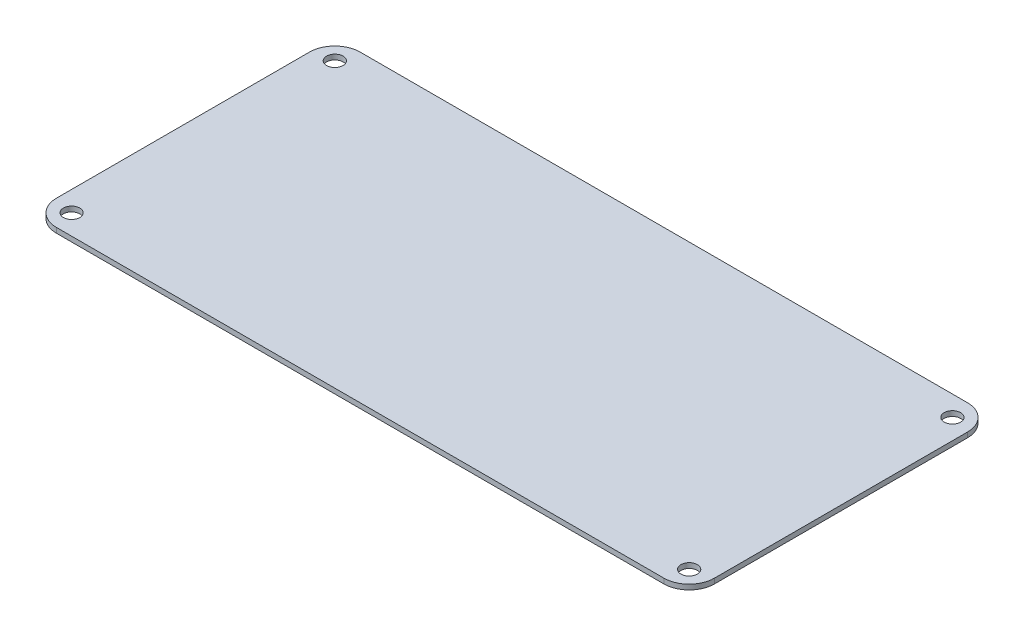
ISO-10303-21;
HEADER;
FILE_DESCRIPTION(('STEP AP214'),'2;1');
FILE_NAME('part.step','',(''),(''),'','','');
FILE_SCHEMA(('AUTOMOTIVE_DESIGN { 1 0 10303 214 1 1 1 1 }'));
ENDSEC;
DATA;
#1=APPLICATION_CONTEXT('core data for automotive mechanical design processes');
#2=APPLICATION_PROTOCOL_DEFINITION('international standard','automotive_design',2000,#1);
#3=PRODUCT_CONTEXT('',#1,'mechanical');
#4=PRODUCT('Part','Part','',(#3));
#5=PRODUCT_RELATED_PRODUCT_CATEGORY('part','',(#4));
#6=PRODUCT_DEFINITION_FORMATION('','',#4);
#7=PRODUCT_DEFINITION_CONTEXT('part definition',#1,'design');
#8=PRODUCT_DEFINITION('design','',#6,#7);
#9=PRODUCT_DEFINITION_SHAPE('','',#8);
#10=(LENGTH_UNIT() NAMED_UNIT(*) SI_UNIT(.MILLI.,.METRE.));
#11=(NAMED_UNIT(*) PLANE_ANGLE_UNIT() SI_UNIT($,.RADIAN.));
#12=(NAMED_UNIT(*) SI_UNIT($,.STERADIAN.) SOLID_ANGLE_UNIT());
#13=UNCERTAINTY_MEASURE_WITH_UNIT(LENGTH_MEASURE(1.E-05),#10,'distance_accuracy_value','');
#14=(GEOMETRIC_REPRESENTATION_CONTEXT(3) GLOBAL_UNCERTAINTY_ASSIGNED_CONTEXT((#13)) GLOBAL_UNIT_ASSIGNED_CONTEXT((#10,
#11,#12)) REPRESENTATION_CONTEXT('',''));
#15=CARTESIAN_POINT('',(0.,0.,0.));
#16=DIRECTION('',(0.,0.,1.));
#17=DIRECTION('',(1.,0.,0.));
#18=AXIS2_PLACEMENT_3D('',#15,#16,#17);
#19=CARTESIAN_POINT('',(-120.,2.,-50.));
#20=DIRECTION('',(0.,-1.,0.));
#21=DIRECTION('',(0.,0.,-1.));
#22=AXIS2_PLACEMENT_3D('',#19,#20,#21);
#23=CYLINDRICAL_SURFACE('',#22,9.99999999999999);
#24=CARTESIAN_POINT('',(-120.,0.,-50.));
#25=DIRECTION('',(0.,1.,0.));
#26=DIRECTION('',(0.,0.,1.));
#27=AXIS2_PLACEMENT_3D('',#24,#25,#26);
#28=CIRCLE('',#27,9.99999999999999);
#29=CARTESIAN_POINT('',(-120.,0.,-60.));
#30=VERTEX_POINT('',#29);
#31=CARTESIAN_POINT('',(-130.,0.,-50.));
#32=VERTEX_POINT('',#31);
#33=EDGE_CURVE('E131',#30,#32,#28,.T.);
#34=ORIENTED_EDGE('',*,*,#33,.T.);
#35=DIRECTION('',(0.,-1.,0.));
#36=VECTOR('',#35,1.);
#37=CARTESIAN_POINT('',(-130.,2.,-50.));
#38=LINE('',#37,#36);
#39=CARTESIAN_POINT('',(-130.,2.,-50.));
#40=VERTEX_POINT('',#39);
#41=EDGE_CURVE('E11',#40,#32,#38,.T.);
#42=ORIENTED_EDGE('',*,*,#41,.F.);
#43=CARTESIAN_POINT('',(-120.,2.,-50.));
#44=DIRECTION('',(0.,1.,0.));
#45=DIRECTION('',(0.,0.,1.));
#46=AXIS2_PLACEMENT_3D('',#43,#44,#45);
#47=CIRCLE('',#46,9.99999999999999);
#48=CARTESIAN_POINT('',(-120.,2.,-60.));
#49=VERTEX_POINT('',#48);
#50=EDGE_CURVE('E145',#49,#40,#47,.T.);
#51=ORIENTED_EDGE('',*,*,#50,.F.);
#52=DIRECTION('',(0.,-1.,0.));
#53=VECTOR('',#52,1.);
#54=CARTESIAN_POINT('',(-120.,2.,-60.));
#55=LINE('',#54,#53);
#56=EDGE_CURVE('E127',#49,#30,#55,.T.);
#57=ORIENTED_EDGE('',*,*,#56,.T.);
#58=EDGE_LOOP('',(#34,#42,#51,#57));
#59=FACE_BOUND('',#58,.T.);
#60=ADVANCED_FACE('F33',(#59),#23,.T.);
#61=CARTESIAN_POINT('',(-130.,2.,-50.));
#62=DIRECTION('',(1.,0.,0.));
#63=DIRECTION('',(0.,0.,-1.));
#64=AXIS2_PLACEMENT_3D('',#61,#62,#63);
#65=PLANE('',#64);
#66=DIRECTION('',(0.,0.,1.));
#67=VECTOR('',#66,1.);
#68=CARTESIAN_POINT('',(-130.,0.,-50.));
#69=LINE('',#68,#67);
#70=CARTESIAN_POINT('',(-130.,0.,50.));
#71=VERTEX_POINT('',#70);
#72=EDGE_CURVE('E134',#32,#71,#69,.T.);
#73=ORIENTED_EDGE('',*,*,#72,.T.);
#74=DIRECTION('',(0.,-1.,0.));
#75=VECTOR('',#74,1.);
#76=CARTESIAN_POINT('',(-130.,2.,50.));
#77=LINE('',#76,#75);
#78=CARTESIAN_POINT('',(-130.,2.,50.));
#79=VERTEX_POINT('',#78);
#80=EDGE_CURVE('E42',#79,#71,#77,.T.);
#81=ORIENTED_EDGE('',*,*,#80,.F.);
#82=DIRECTION('',(0.,0.,1.));
#83=VECTOR('',#82,1.);
#84=CARTESIAN_POINT('',(-130.,2.,-50.));
#85=LINE('',#84,#83);
#86=EDGE_CURVE('E94',#40,#79,#85,.T.);
#87=ORIENTED_EDGE('',*,*,#86,.F.);
#88=ORIENTED_EDGE('',*,*,#41,.T.);
#89=EDGE_LOOP('',(#73,#81,#87,#88));
#90=FACE_BOUND('',#89,.T.);
#91=ADVANCED_FACE('F186',(#90),#65,.F.);
#92=CARTESIAN_POINT('',(-120.,2.,50.));
#93=DIRECTION('',(0.,-1.,0.));
#94=DIRECTION('',(0.,0.,-1.));
#95=AXIS2_PLACEMENT_3D('',#92,#93,#94);
#96=CYLINDRICAL_SURFACE('',#95,10.);
#97=CARTESIAN_POINT('',(-120.,0.,50.));
#98=DIRECTION('',(0.,1.,0.));
#99=DIRECTION('',(0.,0.,1.));
#100=AXIS2_PLACEMENT_3D('',#97,#98,#99);
#101=CIRCLE('',#100,10.);
#102=CARTESIAN_POINT('',(-120.,0.,60.));
#103=VERTEX_POINT('',#102);
#104=EDGE_CURVE('E136',#71,#103,#101,.T.);
#105=ORIENTED_EDGE('',*,*,#104,.T.);
#106=DIRECTION('',(0.,-1.,0.));
#107=VECTOR('',#106,1.);
#108=CARTESIAN_POINT('',(-120.,2.,60.));
#109=LINE('',#108,#107);
#110=CARTESIAN_POINT('',(-120.,2.,60.));
#111=VERTEX_POINT('',#110);
#112=EDGE_CURVE('E152',#111,#103,#109,.T.);
#113=ORIENTED_EDGE('',*,*,#112,.F.);
#114=CARTESIAN_POINT('',(-120.,2.,50.));
#115=DIRECTION('',(0.,1.,0.));
#116=DIRECTION('',(0.,0.,1.));
#117=AXIS2_PLACEMENT_3D('',#114,#115,#116);
#118=CIRCLE('',#117,10.);
#119=EDGE_CURVE('E201',#79,#111,#118,.T.);
#120=ORIENTED_EDGE('',*,*,#119,.F.);
#121=ORIENTED_EDGE('',*,*,#80,.T.);
#122=EDGE_LOOP('',(#105,#113,#120,#121));
#123=FACE_BOUND('',#122,.T.);
#124=ADVANCED_FACE('F191',(#123),#96,.T.);
#125=CARTESIAN_POINT('',(-120.,2.,60.));
#126=DIRECTION('',(0.,0.,-1.));
#127=DIRECTION('',(-1.,0.,0.));
#128=AXIS2_PLACEMENT_3D('',#125,#126,#127);
#129=PLANE('',#128);
#130=DIRECTION('',(1.,0.,0.));
#131=VECTOR('',#130,1.);
#132=CARTESIAN_POINT('',(-120.,0.,60.));
#133=LINE('',#132,#131);
#134=CARTESIAN_POINT('',(120.,0.,60.));
#135=VERTEX_POINT('',#134);
#136=EDGE_CURVE('E138',#103,#135,#133,.T.);
#137=ORIENTED_EDGE('',*,*,#136,.T.);
#138=DIRECTION('',(0.,-1.,0.));
#139=VECTOR('',#138,1.);
#140=CARTESIAN_POINT('',(120.,2.,60.));
#141=LINE('',#140,#139);
#142=CARTESIAN_POINT('',(120.,2.,60.));
#143=VERTEX_POINT('',#142);
#144=EDGE_CURVE('E149',#143,#135,#141,.T.);
#145=ORIENTED_EDGE('',*,*,#144,.F.);
#146=DIRECTION('',(1.,0.,0.));
#147=VECTOR('',#146,1.);
#148=CARTESIAN_POINT('',(-120.,2.,60.));
#149=LINE('',#148,#147);
#150=EDGE_CURVE('E203',#111,#143,#149,.T.);
#151=ORIENTED_EDGE('',*,*,#150,.F.);
#152=ORIENTED_EDGE('',*,*,#112,.T.);
#153=EDGE_LOOP('',(#137,#145,#151,#152));
#154=FACE_BOUND('',#153,.T.);
#155=ADVANCED_FACE('F248',(#154),#129,.F.);
#156=CARTESIAN_POINT('',(120.,2.,50.));
#157=DIRECTION('',(0.,-1.,0.));
#158=DIRECTION('',(0.,0.,-1.));
#159=AXIS2_PLACEMENT_3D('',#156,#157,#158);
#160=CYLINDRICAL_SURFACE('',#159,10.);
#161=CARTESIAN_POINT('',(120.,0.,50.));
#162=DIRECTION('',(0.,1.,0.));
#163=DIRECTION('',(0.,0.,1.));
#164=AXIS2_PLACEMENT_3D('',#161,#162,#163);
#165=CIRCLE('',#164,10.);
#166=CARTESIAN_POINT('',(130.,0.,50.));
#167=VERTEX_POINT('',#166);
#168=EDGE_CURVE('E140',#135,#167,#165,.T.);
#169=ORIENTED_EDGE('',*,*,#168,.T.);
#170=DIRECTION('',(0.,-1.,0.));
#171=VECTOR('',#170,1.);
#172=CARTESIAN_POINT('',(130.,2.,50.));
#173=LINE('',#172,#171);
#174=CARTESIAN_POINT('',(130.,2.,50.));
#175=VERTEX_POINT('',#174);
#176=EDGE_CURVE('E122',#175,#167,#173,.T.);
#177=ORIENTED_EDGE('',*,*,#176,.F.);
#178=CARTESIAN_POINT('',(120.,2.,50.));
#179=DIRECTION('',(0.,1.,0.));
#180=DIRECTION('',(0.,0.,1.));
#181=AXIS2_PLACEMENT_3D('',#178,#179,#180);
#182=CIRCLE('',#181,10.);
#183=EDGE_CURVE('E113',#143,#175,#182,.T.);
#184=ORIENTED_EDGE('',*,*,#183,.F.);
#185=ORIENTED_EDGE('',*,*,#144,.T.);
#186=EDGE_LOOP('',(#169,#177,#184,#185));
#187=FACE_BOUND('',#186,.T.);
#188=ADVANCED_FACE('F245',(#187),#160,.T.);
#189=CARTESIAN_POINT('',(130.,2.,50.));
#190=DIRECTION('',(-1.,0.,0.));
#191=DIRECTION('',(0.,0.,1.));
#192=AXIS2_PLACEMENT_3D('',#189,#190,#191);
#193=PLANE('',#192);
#194=DIRECTION('',(0.,0.,-1.));
#195=VECTOR('',#194,1.);
#196=CARTESIAN_POINT('',(130.,0.,50.));
#197=LINE('',#196,#195);
#198=CARTESIAN_POINT('',(130.,0.,-50.));
#199=VERTEX_POINT('',#198);
#200=EDGE_CURVE('E121',#167,#199,#197,.T.);
#201=ORIENTED_EDGE('',*,*,#200,.T.);
#202=DIRECTION('',(0.,-1.,0.));
#203=VECTOR('',#202,1.);
#204=CARTESIAN_POINT('',(130.,2.,-50.));
#205=LINE('',#204,#203);
#206=CARTESIAN_POINT('',(130.,2.,-50.));
#207=VERTEX_POINT('',#206);
#208=EDGE_CURVE('E118',#207,#199,#205,.T.);
#209=ORIENTED_EDGE('',*,*,#208,.F.);
#210=DIRECTION('',(0.,0.,-1.));
#211=VECTOR('',#210,1.);
#212=CARTESIAN_POINT('',(130.,2.,50.));
#213=LINE('',#212,#211);
#214=EDGE_CURVE('E107',#175,#207,#213,.T.);
#215=ORIENTED_EDGE('',*,*,#214,.F.);
#216=ORIENTED_EDGE('',*,*,#176,.T.);
#217=EDGE_LOOP('',(#201,#209,#215,#216));
#218=FACE_BOUND('',#217,.T.);
#219=ADVANCED_FACE('F119',(#218),#193,.F.);
#220=CARTESIAN_POINT('',(120.,2.,-50.));
#221=DIRECTION('',(0.,-1.,0.));
#222=DIRECTION('',(0.,0.,-1.));
#223=AXIS2_PLACEMENT_3D('',#220,#221,#222);
#224=CYLINDRICAL_SURFACE('',#223,10.);
#225=CARTESIAN_POINT('',(120.,0.,-50.));
#226=DIRECTION('',(0.,1.,0.));
#227=DIRECTION('',(0.,0.,1.));
#228=AXIS2_PLACEMENT_3D('',#225,#226,#227);
#229=CIRCLE('',#228,10.);
#230=CARTESIAN_POINT('',(120.,0.,-60.));
#231=VERTEX_POINT('',#230);
#232=EDGE_CURVE('E80',#199,#231,#229,.T.);
#233=ORIENTED_EDGE('',*,*,#232,.T.);
#234=DIRECTION('',(0.,-1.,0.));
#235=VECTOR('',#234,1.);
#236=CARTESIAN_POINT('',(120.,2.,-60.));
#237=LINE('',#236,#235);
#238=CARTESIAN_POINT('',(120.,2.,-60.));
#239=VERTEX_POINT('',#238);
#240=EDGE_CURVE('E123',#239,#231,#237,.T.);
#241=ORIENTED_EDGE('',*,*,#240,.F.);
#242=CARTESIAN_POINT('',(120.,2.,-50.));
#243=DIRECTION('',(0.,1.,0.));
#244=DIRECTION('',(0.,0.,1.));
#245=AXIS2_PLACEMENT_3D('',#242,#243,#244);
#246=CIRCLE('',#245,10.);
#247=EDGE_CURVE('E111',#207,#239,#246,.T.);
#248=ORIENTED_EDGE('',*,*,#247,.F.);
#249=ORIENTED_EDGE('',*,*,#208,.T.);
#250=EDGE_LOOP('',(#233,#241,#248,#249));
#251=FACE_BOUND('',#250,.T.);
#252=ADVANCED_FACE('F125',(#251),#224,.T.);
#253=CARTESIAN_POINT('',(120.,2.,-60.));
#254=DIRECTION('',(0.,0.,1.));
#255=DIRECTION('',(1.,0.,0.));
#256=AXIS2_PLACEMENT_3D('',#253,#254,#255);
#257=PLANE('',#256);
#258=DIRECTION('',(-1.,0.,0.));
#259=VECTOR('',#258,1.);
#260=CARTESIAN_POINT('',(120.,0.,-60.));
#261=LINE('',#260,#259);
#262=EDGE_CURVE('E86',#231,#30,#261,.T.);
#263=ORIENTED_EDGE('',*,*,#262,.T.);
#264=ORIENTED_EDGE('',*,*,#56,.F.);
#265=DIRECTION('',(-1.,0.,0.));
#266=VECTOR('',#265,1.);
#267=CARTESIAN_POINT('',(120.,2.,-60.));
#268=LINE('',#267,#266);
#269=EDGE_CURVE('E51',#239,#49,#268,.T.);
#270=ORIENTED_EDGE('',*,*,#269,.F.);
#271=ORIENTED_EDGE('',*,*,#240,.T.);
#272=EDGE_LOOP('',(#263,#264,#270,#271));
#273=FACE_BOUND('',#272,.T.);
#274=ADVANCED_FACE('F224',(#273),#257,.F.);
#275=CARTESIAN_POINT('',(-120.,2.,-50.));
#276=DIRECTION('',(0.,1.,0.));
#277=DIRECTION('',(0.,0.,1.));
#278=AXIS2_PLACEMENT_3D('',#275,#276,#277);
#279=PLANE('',#278);
#280=CARTESIAN_POINT('',(122.,2.,-52.));
#281=DIRECTION('',(0.,1.,0.));
#282=DIRECTION('',(0.,0.,1.));
#283=AXIS2_PLACEMENT_3D('',#280,#281,#282);
#284=CIRCLE('',#283,3.24999999999999);
#285=CARTESIAN_POINT('',(122.,2.,-48.75));
#286=VERTEX_POINT('',#285);
#287=EDGE_CURVE('E212',#286,#286,#284,.T.);
#288=ORIENTED_EDGE('',*,*,#287,.F.);
#289=EDGE_LOOP('',(#288));
#290=FACE_BOUND('',#289,.T.);
#291=CARTESIAN_POINT('',(122.,2.,52.));
#292=DIRECTION('',(0.,1.,0.));
#293=DIRECTION('',(0.,0.,1.));
#294=AXIS2_PLACEMENT_3D('',#291,#292,#293);
#295=CIRCLE('',#294,3.24999999999999);
#296=CARTESIAN_POINT('',(122.,2.,55.25));
#297=VERTEX_POINT('',#296);
#298=EDGE_CURVE('E214',#297,#297,#295,.T.);
#299=ORIENTED_EDGE('',*,*,#298,.F.);
#300=EDGE_LOOP('',(#299));
#301=FACE_BOUND('',#300,.T.);
#302=CARTESIAN_POINT('',(-122.,2.,52.));
#303=DIRECTION('',(0.,1.,0.));
#304=DIRECTION('',(0.,0.,1.));
#305=AXIS2_PLACEMENT_3D('',#302,#303,#304);
#306=CIRCLE('',#305,3.25000000000001);
#307=CARTESIAN_POINT('',(-122.,2.,55.25));
#308=VERTEX_POINT('',#307);
#309=EDGE_CURVE('E211',#308,#308,#306,.T.);
#310=ORIENTED_EDGE('',*,*,#309,.F.);
#311=EDGE_LOOP('',(#310));
#312=FACE_BOUND('',#311,.T.);
#313=CARTESIAN_POINT('',(-122.,2.,-52.));
#314=DIRECTION('',(0.,1.,0.));
#315=DIRECTION('',(0.,0.,1.));
#316=AXIS2_PLACEMENT_3D('',#313,#314,#315);
#317=CIRCLE('',#316,3.25000000000001);
#318=CARTESIAN_POINT('',(-122.,2.,-48.7499999999999));
#319=VERTEX_POINT('',#318);
#320=EDGE_CURVE('E161',#319,#319,#317,.T.);
#321=ORIENTED_EDGE('',*,*,#320,.F.);
#322=EDGE_LOOP('',(#321));
#323=FACE_BOUND('',#322,.T.);
#324=ORIENTED_EDGE('',*,*,#50,.T.);
#325=ORIENTED_EDGE('',*,*,#86,.T.);
#326=ORIENTED_EDGE('',*,*,#119,.T.);
#327=ORIENTED_EDGE('',*,*,#150,.T.);
#328=ORIENTED_EDGE('',*,*,#183,.T.);
#329=ORIENTED_EDGE('',*,*,#214,.T.);
#330=ORIENTED_EDGE('',*,*,#247,.T.);
#331=ORIENTED_EDGE('',*,*,#269,.T.);
#332=EDGE_LOOP('',(#324,#325,#326,#327,#328,#329,#330,#331));
#333=FACE_BOUND('',#332,.T.);
#334=ADVANCED_FACE('F109',(#290,#301,#312,#323,#333),#279,.T.);
#335=CARTESIAN_POINT('',(-120.,0.,-50.));
#336=DIRECTION('',(0.,1.,0.));
#337=DIRECTION('',(0.,0.,1.));
#338=AXIS2_PLACEMENT_3D('',#335,#336,#337);
#339=PLANE('',#338);
#340=CARTESIAN_POINT('',(122.,0.,-52.));
#341=DIRECTION('',(0.,1.,0.));
#342=DIRECTION('',(0.,0.,1.));
#343=AXIS2_PLACEMENT_3D('',#340,#341,#342);
#344=CIRCLE('',#343,3.24999999999999);
#345=CARTESIAN_POINT('',(122.,0.,-48.75));
#346=VERTEX_POINT('',#345);
#347=EDGE_CURVE('E36',#346,#346,#344,.T.);
#348=ORIENTED_EDGE('',*,*,#347,.T.);
#349=EDGE_LOOP('',(#348));
#350=FACE_BOUND('',#349,.T.);
#351=CARTESIAN_POINT('',(122.,0.,52.));
#352=DIRECTION('',(0.,1.,0.));
#353=DIRECTION('',(0.,0.,1.));
#354=AXIS2_PLACEMENT_3D('',#351,#352,#353);
#355=CIRCLE('',#354,3.24999999999999);
#356=CARTESIAN_POINT('',(122.,0.,55.25));
#357=VERTEX_POINT('',#356);
#358=EDGE_CURVE('E163',#357,#357,#355,.T.);
#359=ORIENTED_EDGE('',*,*,#358,.T.);
#360=EDGE_LOOP('',(#359));
#361=FACE_BOUND('',#360,.T.);
#362=CARTESIAN_POINT('',(-122.,0.,52.));
#363=DIRECTION('',(0.,1.,0.));
#364=DIRECTION('',(0.,0.,1.));
#365=AXIS2_PLACEMENT_3D('',#362,#363,#364);
#366=CIRCLE('',#365,3.25000000000001);
#367=CARTESIAN_POINT('',(-122.,0.,55.25));
#368=VERTEX_POINT('',#367);
#369=EDGE_CURVE('E160',#368,#368,#366,.T.);
#370=ORIENTED_EDGE('',*,*,#369,.T.);
#371=EDGE_LOOP('',(#370));
#372=FACE_BOUND('',#371,.T.);
#373=CARTESIAN_POINT('',(-122.,0.,-52.));
#374=DIRECTION('',(0.,1.,0.));
#375=DIRECTION('',(0.,0.,1.));
#376=AXIS2_PLACEMENT_3D('',#373,#374,#375);
#377=CIRCLE('',#376,3.25000000000001);
#378=CARTESIAN_POINT('',(-122.,0.,-48.7499999999999));
#379=VERTEX_POINT('',#378);
#380=EDGE_CURVE('E157',#379,#379,#377,.T.);
#381=ORIENTED_EDGE('',*,*,#380,.T.);
#382=EDGE_LOOP('',(#381));
#383=FACE_BOUND('',#382,.T.);
#384=ORIENTED_EDGE('',*,*,#33,.F.);
#385=ORIENTED_EDGE('',*,*,#262,.F.);
#386=ORIENTED_EDGE('',*,*,#232,.F.);
#387=ORIENTED_EDGE('',*,*,#200,.F.);
#388=ORIENTED_EDGE('',*,*,#168,.F.);
#389=ORIENTED_EDGE('',*,*,#136,.F.);
#390=ORIENTED_EDGE('',*,*,#104,.F.);
#391=ORIENTED_EDGE('',*,*,#72,.F.);
#392=EDGE_LOOP('',(#384,#385,#386,#387,#388,#389,#390,#391));
#393=FACE_BOUND('',#392,.T.);
#394=ADVANCED_FACE('F170',(#350,#361,#372,#383,#393),#339,.F.);
#395=CARTESIAN_POINT('',(-122.,-13.,-52.));
#396=DIRECTION('',(0.,1.,0.));
#397=DIRECTION('',(0.,0.,1.));
#398=AXIS2_PLACEMENT_3D('',#395,#396,#397);
#399=CYLINDRICAL_SURFACE('',#398,3.25000000000001);
#400=ORIENTED_EDGE('',*,*,#320,.T.);
#401=EDGE_LOOP('',(#400));
#402=FACE_BOUND('',#401,.T.);
#403=ORIENTED_EDGE('',*,*,#380,.F.);
#404=EDGE_LOOP('',(#403));
#405=FACE_BOUND('',#404,.T.);
#406=ADVANCED_FACE('F229',(#402,#405),#399,.F.);
#407=CARTESIAN_POINT('',(-122.,-13.,52.));
#408=DIRECTION('',(0.,1.,0.));
#409=DIRECTION('',(0.,0.,1.));
#410=AXIS2_PLACEMENT_3D('',#407,#408,#409);
#411=CYLINDRICAL_SURFACE('',#410,3.25000000000001);
#412=ORIENTED_EDGE('',*,*,#309,.T.);
#413=EDGE_LOOP('',(#412));
#414=FACE_BOUND('',#413,.T.);
#415=ORIENTED_EDGE('',*,*,#369,.F.);
#416=EDGE_LOOP('',(#415));
#417=FACE_BOUND('',#416,.T.);
#418=ADVANCED_FACE('F180',(#414,#417),#411,.F.);
#419=CARTESIAN_POINT('',(122.,-13.,52.));
#420=DIRECTION('',(0.,1.,0.));
#421=DIRECTION('',(0.,0.,1.));
#422=AXIS2_PLACEMENT_3D('',#419,#420,#421);
#423=CYLINDRICAL_SURFACE('',#422,3.24999999999999);
#424=ORIENTED_EDGE('',*,*,#298,.T.);
#425=EDGE_LOOP('',(#424));
#426=FACE_BOUND('',#425,.T.);
#427=ORIENTED_EDGE('',*,*,#358,.F.);
#428=EDGE_LOOP('',(#427));
#429=FACE_BOUND('',#428,.T.);
#430=ADVANCED_FACE('F174',(#426,#429),#423,.F.);
#431=CARTESIAN_POINT('',(122.,-13.,-52.));
#432=DIRECTION('',(0.,1.,0.));
#433=DIRECTION('',(0.,0.,1.));
#434=AXIS2_PLACEMENT_3D('',#431,#432,#433);
#435=CYLINDRICAL_SURFACE('',#434,3.24999999999999);
#436=ORIENTED_EDGE('',*,*,#287,.T.);
#437=EDGE_LOOP('',(#436));
#438=FACE_BOUND('',#437,.T.);
#439=ORIENTED_EDGE('',*,*,#347,.F.);
#440=EDGE_LOOP('',(#439));
#441=FACE_BOUND('',#440,.T.);
#442=ADVANCED_FACE('F172',(#438,#441),#435,.F.);
#443=CLOSED_SHELL('',(#60,#91,#124,#155,#188,#219,#252,#274,#334,#394,#406,#418,#430,#442));
#444=MANIFOLD_SOLID_BREP('B2',#443);
#445=ADVANCED_BREP_SHAPE_REPRESENTATION('',(#18,#444),#14);
#446=SHAPE_DEFINITION_REPRESENTATION(#9,#445);
ENDSEC;
END-ISO-10303-21;
